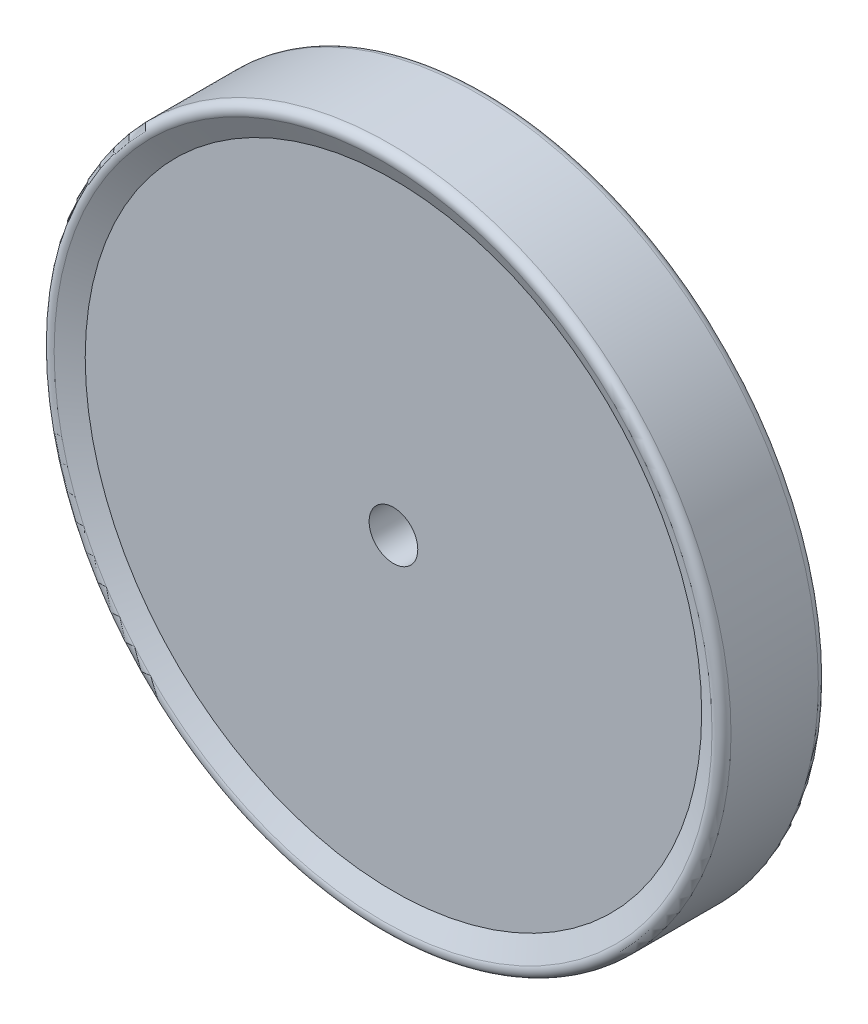
ISO-10303-21;
HEADER;
FILE_DESCRIPTION(('STEP AP214'),'2;1');
FILE_NAME('part.step','',(''),(''),'','','');
FILE_SCHEMA(('AUTOMOTIVE_DESIGN { 1 0 10303 214 1 1 1 1 }'));
ENDSEC;
DATA;
#1=APPLICATION_CONTEXT('core data for automotive mechanical design processes');
#2=APPLICATION_PROTOCOL_DEFINITION('international standard','automotive_design',2000,#1);
#3=PRODUCT_CONTEXT('',#1,'mechanical');
#4=PRODUCT('Part','Part','',(#3));
#5=PRODUCT_RELATED_PRODUCT_CATEGORY('part','',(#4));
#6=PRODUCT_DEFINITION_FORMATION('','',#4);
#7=PRODUCT_DEFINITION_CONTEXT('part definition',#1,'design');
#8=PRODUCT_DEFINITION('design','',#6,#7);
#9=PRODUCT_DEFINITION_SHAPE('','',#8);
#10=(LENGTH_UNIT() NAMED_UNIT(*) SI_UNIT(.MILLI.,.METRE.));
#11=(NAMED_UNIT(*) PLANE_ANGLE_UNIT() SI_UNIT($,.RADIAN.));
#12=(NAMED_UNIT(*) SI_UNIT($,.STERADIAN.) SOLID_ANGLE_UNIT());
#13=UNCERTAINTY_MEASURE_WITH_UNIT(LENGTH_MEASURE(1.E-05),#10,'distance_accuracy_value','');
#14=(GEOMETRIC_REPRESENTATION_CONTEXT(3) GLOBAL_UNCERTAINTY_ASSIGNED_CONTEXT((#13)) GLOBAL_UNIT_ASSIGNED_CONTEXT((#10,
#11,#12)) REPRESENTATION_CONTEXT('',''));
#15=CARTESIAN_POINT('',(0.,0.,0.));
#16=DIRECTION('',(0.,0.,1.));
#17=DIRECTION('',(1.,0.,0.));
#18=AXIS2_PLACEMENT_3D('',#15,#16,#17);
#19=CARTESIAN_POINT('',(0.,0.,-1.));
#20=DIRECTION('',(0.,0.,-1.));
#21=DIRECTION('',(-1.,0.,0.));
#22=AXIS2_PLACEMENT_3D('',#19,#20,#21);
#23=CONICAL_SURFACE('',#22,21.,1.10714871779409);
#24=CARTESIAN_POINT('',(0.,0.,-0.63819660112501));
#25=DIRECTION('',(0.,0.,1.));
#26=DIRECTION('',(1.,0.,0.));
#27=AXIS2_PLACEMENT_3D('',#24,#25,#26);
#28=CIRCLE('',#27,20.27639320225);
#29=CARTESIAN_POINT('',(20.27639320225,0.,-0.63819660112501));
#30=VERTEX_POINT('',#29);
#31=EDGE_CURVE('E11',#30,#30,#28,.F.);
#32=ORIENTED_EDGE('',*,*,#31,.T.);
#33=EDGE_LOOP('',(#32));
#34=FACE_BOUND('',#33,.T.);
#35=CARTESIAN_POINT('',(0.,0.,0.));
#36=DIRECTION('',(0.,0.,-1.));
#37=DIRECTION('',(-1.,0.,0.));
#38=AXIS2_PLACEMENT_3D('',#35,#36,#37);
#39=CIRCLE('',#38,19.);
#40=CARTESIAN_POINT('',(-19.,0.,0.));
#41=VERTEX_POINT('',#40);
#42=EDGE_CURVE('E60',#41,#41,#39,.T.);
#43=ORIENTED_EDGE('',*,*,#42,.F.);
#44=EDGE_LOOP('',(#43));
#45=FACE_BOUND('',#44,.T.);
#46=ADVANCED_FACE('F40',(#34,#45),#23,.F.);
#47=CARTESIAN_POINT('',(0.,0.,0.));
#48=DIRECTION('',(0.,0.,-1.));
#49=DIRECTION('',(-1.,0.,0.));
#50=AXIS2_PLACEMENT_3D('',#47,#48,#49);
#51=CYLINDRICAL_SURFACE('',#50,19.);
#52=CARTESIAN_POINT('',(0.,0.,5.));
#53=DIRECTION('',(0.,0.,-1.));
#54=DIRECTION('',(-1.,0.,0.));
#55=AXIS2_PLACEMENT_3D('',#52,#53,#54);
#56=CIRCLE('',#55,19.);
#57=CARTESIAN_POINT('',(-19.,0.,5.));
#58=VERTEX_POINT('',#57);
#59=EDGE_CURVE('E63',#58,#58,#56,.T.);
#60=ORIENTED_EDGE('',*,*,#59,.F.);
#61=EDGE_LOOP('',(#60));
#62=FACE_BOUND('',#61,.T.);
#63=ORIENTED_EDGE('',*,*,#42,.T.);
#64=EDGE_LOOP('',(#63));
#65=FACE_BOUND('',#64,.T.);
#66=ADVANCED_FACE('F69',(#62,#65),#51,.F.);
#67=CARTESIAN_POINT('',(0.,0.,5.));
#68=DIRECTION('',(0.,0.,1.));
#69=DIRECTION('',(1.,0.,0.));
#70=AXIS2_PLACEMENT_3D('',#67,#68,#69);
#71=CONICAL_SURFACE('',#70,19.,1.10714871779409);
#72=CARTESIAN_POINT('',(0.,0.,5.63819660112501));
#73=DIRECTION('',(0.,0.,-1.));
#74=DIRECTION('',(-1.,0.,0.));
#75=AXIS2_PLACEMENT_3D('',#72,#73,#74);
#76=CIRCLE('',#75,20.27639320225);
#77=CARTESIAN_POINT('',(-20.27639320225,0.,5.63819660112501));
#78=VERTEX_POINT('',#77);
#79=EDGE_CURVE('E47',#78,#78,#76,.F.);
#80=ORIENTED_EDGE('',*,*,#79,.T.);
#81=EDGE_LOOP('',(#80));
#82=FACE_BOUND('',#81,.T.);
#83=ORIENTED_EDGE('',*,*,#59,.T.);
#84=EDGE_LOOP('',(#83));
#85=FACE_BOUND('',#84,.T.);
#86=ADVANCED_FACE('F67',(#82,#85),#71,.F.);
#87=CARTESIAN_POINT('',(0.,0.,0.));
#88=DIRECTION('',(0.,0.,-1.));
#89=DIRECTION('',(-1.,0.,0.));
#90=AXIS2_PLACEMENT_3D('',#87,#88,#89);
#91=CYLINDRICAL_SURFACE('',#90,21.);
#92=CARTESIAN_POINT('',(0.,0.,5.19098300562505));
#93=DIRECTION('',(0.,0.,1.));
#94=DIRECTION('',(1.,0.,0.));
#95=AXIS2_PLACEMENT_3D('',#92,#93,#94);
#96=CIRCLE('',#95,21.);
#97=CARTESIAN_POINT('',(21.,0.,5.19098300562505));
#98=VERTEX_POINT('',#97);
#99=EDGE_CURVE('E51',#98,#98,#96,.F.);
#100=ORIENTED_EDGE('',*,*,#99,.T.);
#101=EDGE_LOOP('',(#100));
#102=FACE_BOUND('',#101,.T.);
#103=CARTESIAN_POINT('',(0.,0.,-0.190983005625053));
#104=DIRECTION('',(0.,0.,1.));
#105=DIRECTION('',(1.,0.,0.));
#106=AXIS2_PLACEMENT_3D('',#103,#104,#105);
#107=CIRCLE('',#106,21.);
#108=CARTESIAN_POINT('',(21.,0.,-0.190983005625053));
#109=VERTEX_POINT('',#108);
#110=EDGE_CURVE('E55',#109,#109,#107,.T.);
#111=ORIENTED_EDGE('',*,*,#110,.T.);
#112=EDGE_LOOP('',(#111));
#113=FACE_BOUND('',#112,.T.);
#114=ADVANCED_FACE('F82',(#102,#113),#91,.T.);
#115=CARTESIAN_POINT('',(0.,0.,5.19098300562505));
#116=DIRECTION('',(0.,0.,1.));
#117=DIRECTION('',(1.,0.,0.));
#118=AXIS2_PLACEMENT_3D('',#115,#116,#117);
#119=TOROIDAL_SURFACE('',#118,20.5,0.5);
#120=ORIENTED_EDGE('',*,*,#79,.F.);
#121=EDGE_LOOP('',(#120));
#122=FACE_BOUND('',#121,.T.);
#123=ORIENTED_EDGE('',*,*,#99,.F.);
#124=EDGE_LOOP('',(#123));
#125=FACE_BOUND('',#124,.T.);
#126=ADVANCED_FACE('F80',(#122,#125),#119,.T.);
#127=CARTESIAN_POINT('',(0.,0.,-0.190983005625053));
#128=DIRECTION('',(0.,0.,1.));
#129=DIRECTION('',(1.,0.,0.));
#130=AXIS2_PLACEMENT_3D('',#127,#128,#129);
#131=TOROIDAL_SURFACE('',#130,20.5,0.5);
#132=ORIENTED_EDGE('',*,*,#110,.F.);
#133=EDGE_LOOP('',(#132));
#134=FACE_BOUND('',#133,.T.);
#135=ORIENTED_EDGE('',*,*,#31,.F.);
#136=EDGE_LOOP('',(#135));
#137=FACE_BOUND('',#136,.T.);
#138=ADVANCED_FACE('F42',(#134,#137),#131,.T.);
#139=CLOSED_SHELL('',(#46,#66,#86,#114,#126,#138));
#140=MANIFOLD_SOLID_BREP('B2',#139);
#141=CARTESIAN_POINT('',(0.,0.,5.));
#142=DIRECTION('',(0.,0.,1.));
#143=DIRECTION('',(1.,0.,0.));
#144=AXIS2_PLACEMENT_3D('',#141,#142,#143);
#145=PLANE('',#144);
#146=CARTESIAN_POINT('',(0.,0.,5.));
#147=DIRECTION('',(0.,0.,1.));
#148=DIRECTION('',(1.,0.,0.));
#149=AXIS2_PLACEMENT_3D('',#146,#147,#148);
#150=CIRCLE('',#149,19.);
#151=CARTESIAN_POINT('',(19.,0.,5.));
#152=VERTEX_POINT('',#151);
#153=EDGE_CURVE('E39',#152,#152,#150,.T.);
#154=ORIENTED_EDGE('',*,*,#153,.T.);
#155=EDGE_LOOP('',(#154));
#156=FACE_BOUND('',#155,.T.);
#157=CARTESIAN_POINT('',(0.,0.,5.));
#158=DIRECTION('',(0.,0.,1.));
#159=DIRECTION('',(1.,0.,0.));
#160=AXIS2_PLACEMENT_3D('',#157,#158,#159);
#161=CIRCLE('',#160,1.5);
#162=CARTESIAN_POINT('',(1.5,0.,5.));
#163=VERTEX_POINT('',#162);
#164=EDGE_CURVE('E142',#163,#163,#161,.T.);
#165=ORIENTED_EDGE('',*,*,#164,.F.);
#166=EDGE_LOOP('',(#165));
#167=FACE_BOUND('',#166,.T.);
#168=ADVANCED_FACE('F131',(#156,#167),#145,.T.);
#169=CARTESIAN_POINT('',(0.,0.,0.));
#170=DIRECTION('',(0.,0.,1.));
#171=DIRECTION('',(1.,0.,0.));
#172=AXIS2_PLACEMENT_3D('',#169,#170,#171);
#173=PLANE('',#172);
#174=CARTESIAN_POINT('',(0.,0.,0.));
#175=DIRECTION('',(0.,0.,1.));
#176=DIRECTION('',(1.,0.,0.));
#177=AXIS2_PLACEMENT_3D('',#174,#175,#176);
#178=CIRCLE('',#177,19.);
#179=CARTESIAN_POINT('',(19.,0.,0.));
#180=VERTEX_POINT('',#179);
#181=EDGE_CURVE('E135',#180,#180,#178,.T.);
#182=ORIENTED_EDGE('',*,*,#181,.F.);
#183=EDGE_LOOP('',(#182));
#184=FACE_BOUND('',#183,.T.);
#185=CARTESIAN_POINT('',(0.,0.,0.));
#186=DIRECTION('',(0.,0.,1.));
#187=DIRECTION('',(1.,0.,0.));
#188=AXIS2_PLACEMENT_3D('',#185,#186,#187);
#189=CIRCLE('',#188,1.5);
#190=CARTESIAN_POINT('',(1.5,0.,0.));
#191=VERTEX_POINT('',#190);
#192=EDGE_CURVE('E144',#191,#191,#189,.T.);
#193=ORIENTED_EDGE('',*,*,#192,.T.);
#194=EDGE_LOOP('',(#193));
#195=FACE_BOUND('',#194,.T.);
#196=ADVANCED_FACE('F154',(#184,#195),#173,.F.);
#197=CARTESIAN_POINT('',(0.,0.,5.));
#198=DIRECTION('',(0.,0.,-1.));
#199=DIRECTION('',(-1.,0.,0.));
#200=AXIS2_PLACEMENT_3D('',#197,#198,#199);
#201=CYLINDRICAL_SURFACE('',#200,19.);
#202=ORIENTED_EDGE('',*,*,#153,.F.);
#203=EDGE_LOOP('',(#202));
#204=FACE_BOUND('',#203,.T.);
#205=ORIENTED_EDGE('',*,*,#181,.T.);
#206=EDGE_LOOP('',(#205));
#207=FACE_BOUND('',#206,.T.);
#208=ADVANCED_FACE('F133',(#204,#207),#201,.T.);
#209=CARTESIAN_POINT('',(0.,0.,5.));
#210=DIRECTION('',(0.,0.,-1.));
#211=DIRECTION('',(-1.,0.,0.));
#212=AXIS2_PLACEMENT_3D('',#209,#210,#211);
#213=CYLINDRICAL_SURFACE('',#212,1.5);
#214=ORIENTED_EDGE('',*,*,#164,.T.);
#215=EDGE_LOOP('',(#214));
#216=FACE_BOUND('',#215,.T.);
#217=ORIENTED_EDGE('',*,*,#192,.F.);
#218=EDGE_LOOP('',(#217));
#219=FACE_BOUND('',#218,.T.);
#220=ADVANCED_FACE('F150',(#216,#219),#213,.F.);
#221=CLOSED_SHELL('',(#168,#196,#208,#220));
#222=MANIFOLD_SOLID_BREP('B6',#221);
#223=ADVANCED_BREP_SHAPE_REPRESENTATION('',(#18,#140,#222),#14);
#224=SHAPE_DEFINITION_REPRESENTATION(#9,#223);
ENDSEC;
END-ISO-10303-21;
